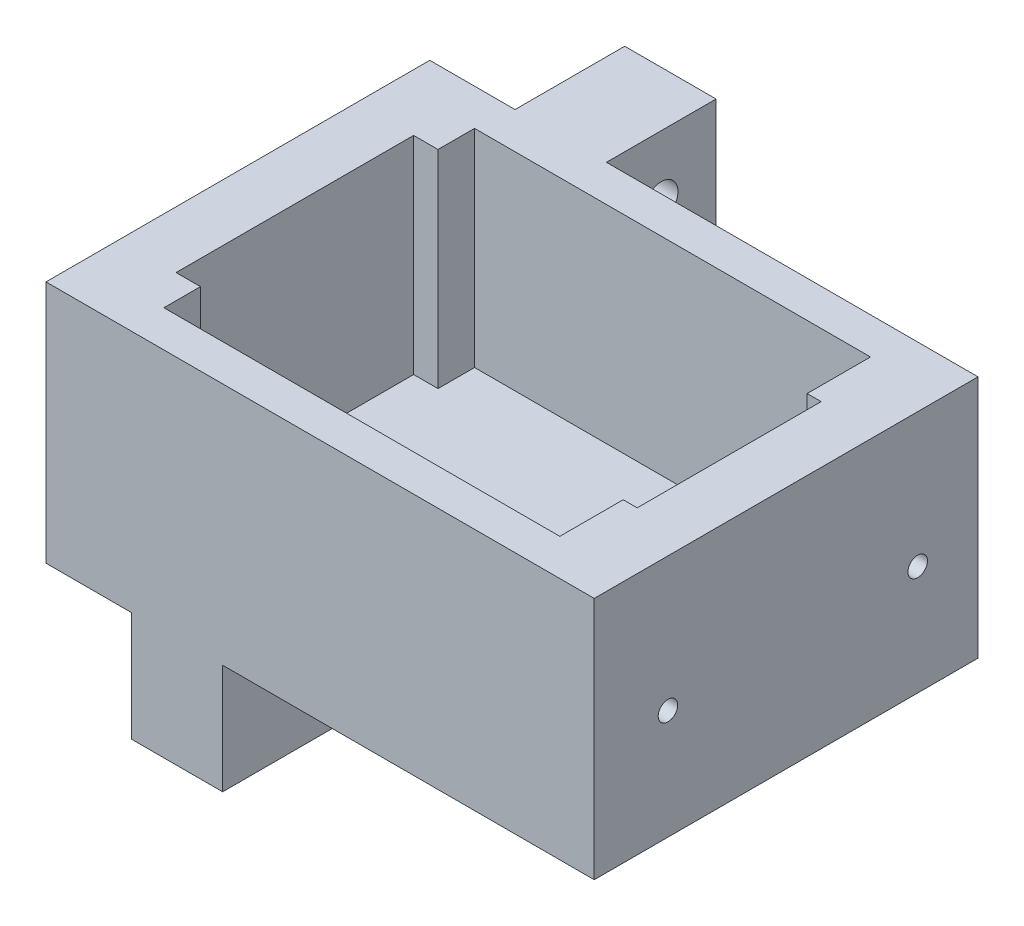
ISO-10303-21;
HEADER;
FILE_DESCRIPTION(('STEP AP214'),'2;1');
FILE_NAME('part.step','',(''),(''),'','','');
FILE_SCHEMA(('AUTOMOTIVE_DESIGN { 1 0 10303 214 1 1 1 1 }'));
ENDSEC;
DATA;
#1=APPLICATION_CONTEXT('core data for automotive mechanical design processes');
#2=APPLICATION_PROTOCOL_DEFINITION('international standard','automotive_design',2000,#1);
#3=PRODUCT_CONTEXT('',#1,'mechanical');
#4=PRODUCT('Part','Part','',(#3));
#5=PRODUCT_RELATED_PRODUCT_CATEGORY('part','',(#4));
#6=PRODUCT_DEFINITION_FORMATION('','',#4);
#7=PRODUCT_DEFINITION_CONTEXT('part definition',#1,'design');
#8=PRODUCT_DEFINITION('design','',#6,#7);
#9=PRODUCT_DEFINITION_SHAPE('','',#8);
#10=(LENGTH_UNIT() NAMED_UNIT(*) SI_UNIT(.MILLI.,.METRE.));
#11=(NAMED_UNIT(*) PLANE_ANGLE_UNIT() SI_UNIT($,.RADIAN.));
#12=(NAMED_UNIT(*) SI_UNIT($,.STERADIAN.) SOLID_ANGLE_UNIT());
#13=UNCERTAINTY_MEASURE_WITH_UNIT(LENGTH_MEASURE(1.E-05),#10,'distance_accuracy_value','');
#14=(GEOMETRIC_REPRESENTATION_CONTEXT(3) GLOBAL_UNCERTAINTY_ASSIGNED_CONTEXT((#13)) GLOBAL_UNIT_ASSIGNED_CONTEXT((#10,
#11,#12)) REPRESENTATION_CONTEXT('',''));
#15=CARTESIAN_POINT('',(0.,0.,0.));
#16=DIRECTION('',(0.,0.,1.));
#17=DIRECTION('',(1.,0.,0.));
#18=AXIS2_PLACEMENT_3D('',#15,#16,#17);
#19=CARTESIAN_POINT('',(0.,20.,-31.5));
#20=DIRECTION('',(0.,0.,1.));
#21=DIRECTION('',(1.,0.,0.));
#22=AXIS2_PLACEMENT_3D('',#19,#20,#21);
#23=PLANE('',#22);
#24=DIRECTION('',(0.,-1.,0.));
#25=VECTOR('',#24,1.);
#26=CARTESIAN_POINT('',(14.5,0.,-31.5));
#27=LINE('',#26,#25);
#28=CARTESIAN_POINT('',(14.5,20.,-31.5));
#29=VERTEX_POINT('',#28);
#30=CARTESIAN_POINT('',(14.5,0.,-31.5));
#31=VERTEX_POINT('',#30);
#32=EDGE_CURVE('E69',#29,#31,#27,.T.);
#33=ORIENTED_EDGE('',*,*,#32,.F.);
#34=DIRECTION('',(-1.,0.,0.));
#35=VECTOR('',#34,1.);
#36=CARTESIAN_POINT('',(0.,20.,-31.5));
#37=LINE('',#36,#35);
#38=CARTESIAN_POINT('',(45.,20.,-31.5));
#39=VERTEX_POINT('',#38);
#40=EDGE_CURVE('E485',#39,#29,#37,.T.);
#41=ORIENTED_EDGE('',*,*,#40,.F.);
#42=DIRECTION('',(0.,-1.,0.));
#43=VECTOR('',#42,1.);
#44=CARTESIAN_POINT('',(45.,20.,-31.5));
#45=LINE('',#44,#43);
#46=CARTESIAN_POINT('',(45.,0.,-31.5));
#47=VERTEX_POINT('',#46);
#48=EDGE_CURVE('E506',#39,#47,#45,.T.);
#49=ORIENTED_EDGE('',*,*,#48,.T.);
#50=DIRECTION('',(-1.,0.,0.));
#51=VECTOR('',#50,1.);
#52=CARTESIAN_POINT('',(0.,0.,-31.5));
#53=LINE('',#52,#51);
#54=EDGE_CURVE('E479',#47,#31,#53,.T.);
#55=ORIENTED_EDGE('',*,*,#54,.T.);
#56=EDGE_LOOP('',(#33,#41,#49,#55));
#57=FACE_BOUND('',#56,.T.);
#58=ADVANCED_FACE('F45',(#57),#23,.F.);
#59=CARTESIAN_POINT('',(0.,0.,0.));
#60=DIRECTION('',(0.,-1.,0.));
#61=DIRECTION('',(0.,0.,-1.));
#62=AXIS2_PLACEMENT_3D('',#59,#60,#61);
#63=PLANE('',#62);
#64=DIRECTION('',(-1.,0.,0.));
#65=VECTOR('',#64,1.);
#66=CARTESIAN_POINT('',(14.5,0.,-30.5));
#67=LINE('',#66,#65);
#68=CARTESIAN_POINT('',(14.5,0.,-30.5));
#69=VERTEX_POINT('',#68);
#70=CARTESIAN_POINT('',(7.,0.,-30.5));
#71=VERTEX_POINT('',#70);
#72=EDGE_CURVE('E294',#69,#71,#67,.T.);
#73=ORIENTED_EDGE('',*,*,#72,.T.);
#74=DIRECTION('',(0.,0.,1.));
#75=VECTOR('',#74,1.);
#76=CARTESIAN_POINT('',(7.,0.,0.));
#77=LINE('',#76,#75);
#78=CARTESIAN_POINT('',(7.,0.,0.));
#79=VERTEX_POINT('',#78);
#80=EDGE_CURVE('E302',#71,#79,#77,.T.);
#81=ORIENTED_EDGE('',*,*,#80,.T.);
#82=DIRECTION('',(1.,0.,0.));
#83=VECTOR('',#82,1.);
#84=CARTESIAN_POINT('',(0.,0.,0.));
#85=LINE('',#84,#83);
#86=CARTESIAN_POINT('',(0.,0.,0.));
#87=VERTEX_POINT('',#86);
#88=EDGE_CURVE('E493',#87,#79,#85,.T.);
#89=ORIENTED_EDGE('',*,*,#88,.F.);
#90=DIRECTION('',(0.,0.,1.));
#91=VECTOR('',#90,1.);
#92=CARTESIAN_POINT('',(0.,0.,0.));
#93=LINE('',#92,#91);
#94=CARTESIAN_POINT('',(0.,0.,-31.5));
#95=VERTEX_POINT('',#94);
#96=EDGE_CURVE('E440',#95,#87,#93,.T.);
#97=ORIENTED_EDGE('',*,*,#96,.F.);
#98=CARTESIAN_POINT('',(7.,0.,-31.5));
#99=VERTEX_POINT('',#98);
#100=EDGE_CURVE('E500',#99,#95,#53,.T.);
#101=ORIENTED_EDGE('',*,*,#100,.F.);
#102=DIRECTION('',(0.,0.,-1.));
#103=VECTOR('',#102,1.);
#104=CARTESIAN_POINT('',(7.,0.,0.));
#105=LINE('',#104,#103);
#106=CARTESIAN_POINT('',(7.,0.,-40.5));
#107=VERTEX_POINT('',#106);
#108=EDGE_CURVE('E224',#99,#107,#105,.T.);
#109=ORIENTED_EDGE('',*,*,#108,.T.);
#110=DIRECTION('',(-1.,0.,0.));
#111=VECTOR('',#110,1.);
#112=CARTESIAN_POINT('',(14.5,0.,-40.5));
#113=LINE('',#112,#111);
#114=CARTESIAN_POINT('',(14.5,0.,-40.5));
#115=VERTEX_POINT('',#114);
#116=EDGE_CURVE('E219',#115,#107,#113,.T.);
#117=ORIENTED_EDGE('',*,*,#116,.F.);
#118=DIRECTION('',(0.,0.,-1.));
#119=VECTOR('',#118,1.);
#120=CARTESIAN_POINT('',(14.5,0.,0.));
#121=LINE('',#120,#119);
#122=EDGE_CURVE('E207',#31,#115,#121,.T.);
#123=ORIENTED_EDGE('',*,*,#122,.F.);
#124=ORIENTED_EDGE('',*,*,#54,.F.);
#125=DIRECTION('',(0.,0.,-1.));
#126=VECTOR('',#125,1.);
#127=CARTESIAN_POINT('',(45.,0.,0.));
#128=LINE('',#127,#126);
#129=CARTESIAN_POINT('',(45.,0.,0.));
#130=VERTEX_POINT('',#129);
#131=EDGE_CURVE('E497',#130,#47,#128,.T.);
#132=ORIENTED_EDGE('',*,*,#131,.F.);
#133=CARTESIAN_POINT('',(14.5,0.,0.));
#134=VERTEX_POINT('',#133);
#135=EDGE_CURVE('E492',#134,#130,#85,.T.);
#136=ORIENTED_EDGE('',*,*,#135,.F.);
#137=DIRECTION('',(0.,0.,1.));
#138=VECTOR('',#137,1.);
#139=CARTESIAN_POINT('',(14.5,0.,0.));
#140=LINE('',#139,#138);
#141=EDGE_CURVE('E279',#69,#134,#140,.T.);
#142=ORIENTED_EDGE('',*,*,#141,.F.);
#143=EDGE_LOOP('',(#73,#81,#89,#97,#101,#109,#117,#123,#124,#132,#136,#142));
#144=FACE_BOUND('',#143,.T.);
#145=ADVANCED_FACE('F221',(#144),#63,.T.);
#146=CARTESIAN_POINT('',(0.,20.,0.));
#147=DIRECTION('',(1.,0.,0.));
#148=DIRECTION('',(0.,0.,-1.));
#149=AXIS2_PLACEMENT_3D('',#146,#147,#148);
#150=PLANE('',#149);
#151=ORIENTED_EDGE('',*,*,#96,.T.);
#152=DIRECTION('',(0.,-1.,0.));
#153=VECTOR('',#152,1.);
#154=CARTESIAN_POINT('',(0.,20.,0.));
#155=LINE('',#154,#153);
#156=CARTESIAN_POINT('',(0.,20.,0.));
#157=VERTEX_POINT('',#156);
#158=EDGE_CURVE('E11',#157,#87,#155,.T.);
#159=ORIENTED_EDGE('',*,*,#158,.F.);
#160=DIRECTION('',(0.,0.,1.));
#161=VECTOR('',#160,1.);
#162=CARTESIAN_POINT('',(0.,20.,0.));
#163=LINE('',#162,#161);
#164=CARTESIAN_POINT('',(0.,20.,-31.5));
#165=VERTEX_POINT('',#164);
#166=EDGE_CURVE('E474',#165,#157,#163,.T.);
#167=ORIENTED_EDGE('',*,*,#166,.F.);
#168=DIRECTION('',(0.,-1.,0.));
#169=VECTOR('',#168,1.);
#170=CARTESIAN_POINT('',(0.,20.,-31.5));
#171=LINE('',#170,#169);
#172=EDGE_CURVE('E488',#165,#95,#171,.T.);
#173=ORIENTED_EDGE('',*,*,#172,.T.);
#174=EDGE_LOOP('',(#151,#159,#167,#173));
#175=FACE_BOUND('',#174,.T.);
#176=ADVANCED_FACE('F47',(#175),#150,.F.);
#177=CARTESIAN_POINT('',(0.,20.,0.));
#178=DIRECTION('',(0.,0.,-1.));
#179=DIRECTION('',(-1.,0.,0.));
#180=AXIS2_PLACEMENT_3D('',#177,#178,#179);
#181=PLANE('',#180);
#182=ORIENTED_EDGE('',*,*,#88,.T.);
#183=DIRECTION('',(0.,-1.,0.));
#184=VECTOR('',#183,1.);
#185=CARTESIAN_POINT('',(7.,0.,0.));
#186=LINE('',#185,#184);
#187=CARTESIAN_POINT('',(7.,-9.,0.));
#188=VERTEX_POINT('',#187);
#189=EDGE_CURVE('E275',#79,#188,#186,.T.);
#190=ORIENTED_EDGE('',*,*,#189,.T.);
#191=DIRECTION('',(-1.,0.,0.));
#192=VECTOR('',#191,1.);
#193=CARTESIAN_POINT('',(14.5,-9.,0.));
#194=LINE('',#193,#192);
#195=CARTESIAN_POINT('',(14.5,-9.,0.));
#196=VERTEX_POINT('',#195);
#197=EDGE_CURVE('E317',#196,#188,#194,.T.);
#198=ORIENTED_EDGE('',*,*,#197,.F.);
#199=DIRECTION('',(0.,-1.,0.));
#200=VECTOR('',#199,1.);
#201=CARTESIAN_POINT('',(14.5,0.,0.));
#202=LINE('',#201,#200);
#203=EDGE_CURVE('E291',#134,#196,#202,.T.);
#204=ORIENTED_EDGE('',*,*,#203,.F.);
#205=ORIENTED_EDGE('',*,*,#135,.T.);
#206=DIRECTION('',(0.,-1.,0.));
#207=VECTOR('',#206,1.);
#208=CARTESIAN_POINT('',(45.,20.,0.));
#209=LINE('',#208,#207);
#210=CARTESIAN_POINT('',(45.,20.,0.));
#211=VERTEX_POINT('',#210);
#212=EDGE_CURVE('E54',#211,#130,#209,.T.);
#213=ORIENTED_EDGE('',*,*,#212,.F.);
#214=DIRECTION('',(1.,0.,0.));
#215=VECTOR('',#214,1.);
#216=CARTESIAN_POINT('',(0.,20.,0.));
#217=LINE('',#216,#215);
#218=EDGE_CURVE('E478',#157,#211,#217,.T.);
#219=ORIENTED_EDGE('',*,*,#218,.F.);
#220=ORIENTED_EDGE('',*,*,#158,.T.);
#221=EDGE_LOOP('',(#182,#190,#198,#204,#205,#213,#219,#220));
#222=FACE_BOUND('',#221,.T.);
#223=ADVANCED_FACE('F524',(#222),#181,.F.);
#224=CARTESIAN_POINT('',(45.,20.,0.));
#225=DIRECTION('',(-1.,0.,0.));
#226=DIRECTION('',(0.,0.,1.));
#227=AXIS2_PLACEMENT_3D('',#224,#225,#226);
#228=PLANE('',#227);
#229=CARTESIAN_POINT('',(45.,9.,-26.55));
#230=DIRECTION('',(-1.,0.,0.));
#231=DIRECTION('',(0.,0.,1.));
#232=AXIS2_PLACEMENT_3D('',#229,#230,#231);
#233=CIRCLE('',#232,0.799999999999999);
#234=CARTESIAN_POINT('',(45.,9.,-25.75));
#235=VERTEX_POINT('',#234);
#236=EDGE_CURVE('E330',#235,#235,#233,.F.);
#237=ORIENTED_EDGE('',*,*,#236,.F.);
#238=EDGE_LOOP('',(#237));
#239=FACE_BOUND('',#238,.T.);
#240=CARTESIAN_POINT('',(45.,9.,-6.05));
#241=DIRECTION('',(-1.,0.,0.));
#242=DIRECTION('',(0.,0.,1.));
#243=AXIS2_PLACEMENT_3D('',#240,#241,#242);
#244=CIRCLE('',#243,0.800000000000001);
#245=CARTESIAN_POINT('',(45.,9.,-5.25));
#246=VERTEX_POINT('',#245);
#247=EDGE_CURVE('E331',#246,#246,#244,.F.);
#248=ORIENTED_EDGE('',*,*,#247,.F.);
#249=EDGE_LOOP('',(#248));
#250=FACE_BOUND('',#249,.T.);
#251=ORIENTED_EDGE('',*,*,#131,.T.);
#252=ORIENTED_EDGE('',*,*,#48,.F.);
#253=DIRECTION('',(0.,0.,-1.));
#254=VECTOR('',#253,1.);
#255=CARTESIAN_POINT('',(45.,20.,0.));
#256=LINE('',#255,#254);
#257=EDGE_CURVE('E482',#211,#39,#256,.T.);
#258=ORIENTED_EDGE('',*,*,#257,.F.);
#259=ORIENTED_EDGE('',*,*,#212,.T.);
#260=EDGE_LOOP('',(#251,#252,#258,#259));
#261=FACE_BOUND('',#260,.T.);
#262=ADVANCED_FACE('F515',(#239,#250,#261),#228,.F.);
#263=CARTESIAN_POINT('',(7.,20.,-31.5));
#264=VERTEX_POINT('',#263);
#265=EDGE_CURVE('E61',#264,#165,#37,.T.);
#266=ORIENTED_EDGE('',*,*,#265,.F.);
#267=DIRECTION('',(0.,-1.,0.));
#268=VECTOR('',#267,1.);
#269=CARTESIAN_POINT('',(7.,0.,-31.5));
#270=LINE('',#269,#268);
#271=EDGE_CURVE('E260',#264,#99,#270,.T.);
#272=ORIENTED_EDGE('',*,*,#271,.T.);
#273=ORIENTED_EDGE('',*,*,#100,.T.);
#274=ORIENTED_EDGE('',*,*,#172,.F.);
#275=EDGE_LOOP('',(#266,#272,#273,#274));
#276=FACE_BOUND('',#275,.T.);
#277=ADVANCED_FACE('F556',(#276),#23,.F.);
#278=CARTESIAN_POINT('',(0.,20.,0.));
#279=DIRECTION('',(0.,-1.,0.));
#280=DIRECTION('',(0.,0.,-1.));
#281=AXIS2_PLACEMENT_3D('',#278,#279,#280);
#282=PLANE('',#281);
#283=DIRECTION('',(-1.,0.,0.));
#284=VECTOR('',#283,1.);
#285=CARTESIAN_POINT('',(6.675,20.,-25.5));
#286=LINE('',#285,#284);
#287=CARTESIAN_POINT('',(6.675,20.,-25.5));
#288=VERTEX_POINT('',#287);
#289=CARTESIAN_POINT('',(4.67500000000001,20.,-25.5));
#290=VERTEX_POINT('',#289);
#291=EDGE_CURVE('E394',#288,#290,#286,.T.);
#292=ORIENTED_EDGE('',*,*,#291,.F.);
#293=DIRECTION('',(0.,0.,1.));
#294=VECTOR('',#293,1.);
#295=CARTESIAN_POINT('',(6.675,20.,-28.5));
#296=LINE('',#295,#294);
#297=CARTESIAN_POINT('',(6.675,20.,-28.5));
#298=VERTEX_POINT('',#297);
#299=EDGE_CURVE('E335',#298,#288,#296,.T.);
#300=ORIENTED_EDGE('',*,*,#299,.F.);
#301=DIRECTION('',(-1.,0.,0.));
#302=VECTOR('',#301,1.);
#303=CARTESIAN_POINT('',(39.175,20.,-28.5));
#304=LINE('',#303,#302);
#305=CARTESIAN_POINT('',(39.175,20.,-28.5));
#306=VERTEX_POINT('',#305);
#307=EDGE_CURVE('E347',#306,#298,#304,.T.);
#308=ORIENTED_EDGE('',*,*,#307,.F.);
#309=DIRECTION('',(0.,0.,-1.));
#310=VECTOR('',#309,1.);
#311=CARTESIAN_POINT('',(39.175,20.,-23.3));
#312=LINE('',#311,#310);
#313=CARTESIAN_POINT('',(39.175,20.,-23.3));
#314=VERTEX_POINT('',#313);
#315=EDGE_CURVE('E430',#314,#306,#312,.T.);
#316=ORIENTED_EDGE('',*,*,#315,.F.);
#317=DIRECTION('',(-1.,0.,0.));
#318=VECTOR('',#317,1.);
#319=CARTESIAN_POINT('',(40.325,20.,-23.3));
#320=LINE('',#319,#318);
#321=CARTESIAN_POINT('',(40.325,20.,-23.3));
#322=VERTEX_POINT('',#321);
#323=EDGE_CURVE('E426',#322,#314,#320,.T.);
#324=ORIENTED_EDGE('',*,*,#323,.F.);
#325=DIRECTION('',(0.,0.,-1.));
#326=VECTOR('',#325,1.);
#327=CARTESIAN_POINT('',(40.325,20.,-8.2));
#328=LINE('',#327,#326);
#329=CARTESIAN_POINT('',(40.325,20.,-8.2));
#330=VERTEX_POINT('',#329);
#331=EDGE_CURVE('E422',#330,#322,#328,.T.);
#332=ORIENTED_EDGE('',*,*,#331,.F.);
#333=DIRECTION('',(1.,0.,0.));
#334=VECTOR('',#333,1.);
#335=CARTESIAN_POINT('',(39.175,20.,-8.2));
#336=LINE('',#335,#334);
#337=CARTESIAN_POINT('',(39.175,20.,-8.2));
#338=VERTEX_POINT('',#337);
#339=EDGE_CURVE('E418',#338,#330,#336,.T.);
#340=ORIENTED_EDGE('',*,*,#339,.F.);
#341=DIRECTION('',(0.,0.,-1.));
#342=VECTOR('',#341,1.);
#343=CARTESIAN_POINT('',(39.175,20.,-3.));
#344=LINE('',#343,#342);
#345=CARTESIAN_POINT('',(39.175,20.,-3.));
#346=VERTEX_POINT('',#345);
#347=EDGE_CURVE('E414',#346,#338,#344,.T.);
#348=ORIENTED_EDGE('',*,*,#347,.F.);
#349=DIRECTION('',(1.,0.,0.));
#350=VECTOR('',#349,1.);
#351=CARTESIAN_POINT('',(6.675,20.,-3.));
#352=LINE('',#351,#350);
#353=CARTESIAN_POINT('',(6.675,20.,-3.));
#354=VERTEX_POINT('',#353);
#355=EDGE_CURVE('E410',#354,#346,#352,.T.);
#356=ORIENTED_EDGE('',*,*,#355,.F.);
#357=DIRECTION('',(0.,0.,1.));
#358=VECTOR('',#357,1.);
#359=CARTESIAN_POINT('',(6.675,20.,-6.));
#360=LINE('',#359,#358);
#361=CARTESIAN_POINT('',(6.675,20.,-6.));
#362=VERTEX_POINT('',#361);
#363=EDGE_CURVE('E406',#362,#354,#360,.T.);
#364=ORIENTED_EDGE('',*,*,#363,.F.);
#365=DIRECTION('',(1.,0.,0.));
#366=VECTOR('',#365,1.);
#367=CARTESIAN_POINT('',(4.67500000000001,20.,-6.));
#368=LINE('',#367,#366);
#369=CARTESIAN_POINT('',(4.67500000000001,20.,-6.));
#370=VERTEX_POINT('',#369);
#371=EDGE_CURVE('E402',#370,#362,#368,.T.);
#372=ORIENTED_EDGE('',*,*,#371,.F.);
#373=DIRECTION('',(0.,0.,1.));
#374=VECTOR('',#373,1.);
#375=CARTESIAN_POINT('',(4.67500000000001,20.,-25.5));
#376=LINE('',#375,#374);
#377=EDGE_CURVE('E398',#290,#370,#376,.T.);
#378=ORIENTED_EDGE('',*,*,#377,.F.);
#379=EDGE_LOOP('',(#292,#300,#308,#316,#324,#332,#340,#348,#356,#364,#372,#378));
#380=FACE_BOUND('',#379,.T.);
#381=ORIENTED_EDGE('',*,*,#166,.T.);
#382=ORIENTED_EDGE('',*,*,#218,.T.);
#383=ORIENTED_EDGE('',*,*,#257,.T.);
#384=ORIENTED_EDGE('',*,*,#40,.T.);
#385=DIRECTION('',(0.,0.,-1.));
#386=VECTOR('',#385,1.);
#387=CARTESIAN_POINT('',(14.5,20.,0.));
#388=LINE('',#387,#386);
#389=CARTESIAN_POINT('',(14.5,20.,-40.5));
#390=VERTEX_POINT('',#389);
#391=EDGE_CURVE('E230',#29,#390,#388,.T.);
#392=ORIENTED_EDGE('',*,*,#391,.T.);
#393=DIRECTION('',(-1.,0.,0.));
#394=VECTOR('',#393,1.);
#395=CARTESIAN_POINT('',(14.5,20.,-40.5));
#396=LINE('',#395,#394);
#397=CARTESIAN_POINT('',(7.,20.,-40.5));
#398=VERTEX_POINT('',#397);
#399=EDGE_CURVE('E229',#390,#398,#396,.T.);
#400=ORIENTED_EDGE('',*,*,#399,.T.);
#401=DIRECTION('',(0.,0.,-1.));
#402=VECTOR('',#401,1.);
#403=CARTESIAN_POINT('',(7.,20.,0.));
#404=LINE('',#403,#402);
#405=EDGE_CURVE('E263',#264,#398,#404,.T.);
#406=ORIENTED_EDGE('',*,*,#405,.F.);
#407=ORIENTED_EDGE('',*,*,#265,.T.);
#408=EDGE_LOOP('',(#381,#382,#383,#384,#392,#400,#406,#407));
#409=FACE_BOUND('',#408,.T.);
#410=ADVANCED_FACE('F521',(#380,#409),#282,.F.);
#411=CARTESIAN_POINT('',(6.675,3.,-28.5));
#412=DIRECTION('',(-1.,0.,0.));
#413=DIRECTION('',(0.,0.,1.));
#414=AXIS2_PLACEMENT_3D('',#411,#412,#413);
#415=PLANE('',#414);
#416=ORIENTED_EDGE('',*,*,#299,.T.);
#417=DIRECTION('',(0.,1.,0.));
#418=VECTOR('',#417,1.);
#419=CARTESIAN_POINT('',(6.675,3.,-25.5));
#420=LINE('',#419,#418);
#421=CARTESIAN_POINT('',(6.675,3.,-25.5));
#422=VERTEX_POINT('',#421);
#423=EDGE_CURVE('E391',#422,#288,#420,.T.);
#424=ORIENTED_EDGE('',*,*,#423,.F.);
#425=DIRECTION('',(0.,0.,1.));
#426=VECTOR('',#425,1.);
#427=CARTESIAN_POINT('',(6.675,3.,-28.5));
#428=LINE('',#427,#426);
#429=CARTESIAN_POINT('',(6.675,3.,-28.5));
#430=VERTEX_POINT('',#429);
#431=EDGE_CURVE('E342',#430,#422,#428,.T.);
#432=ORIENTED_EDGE('',*,*,#431,.F.);
#433=DIRECTION('',(0.,1.,0.));
#434=VECTOR('',#433,1.);
#435=CARTESIAN_POINT('',(6.675,3.,-28.5));
#436=LINE('',#435,#434);
#437=EDGE_CURVE('E437',#430,#298,#436,.T.);
#438=ORIENTED_EDGE('',*,*,#437,.T.);
#439=EDGE_LOOP('',(#416,#424,#432,#438));
#440=FACE_BOUND('',#439,.T.);
#441=ADVANCED_FACE('F567',(#440),#415,.F.);
#442=CARTESIAN_POINT('',(39.175,3.,-28.5));
#443=DIRECTION('',(0.,0.,-1.));
#444=DIRECTION('',(-1.,0.,0.));
#445=AXIS2_PLACEMENT_3D('',#442,#443,#444);
#446=PLANE('',#445);
#447=ORIENTED_EDGE('',*,*,#307,.T.);
#448=ORIENTED_EDGE('',*,*,#437,.F.);
#449=DIRECTION('',(-1.,0.,0.));
#450=VECTOR('',#449,1.);
#451=CARTESIAN_POINT('',(39.175,3.,-28.5));
#452=LINE('',#451,#450);
#453=CARTESIAN_POINT('',(39.175,3.,-28.5));
#454=VERTEX_POINT('',#453);
#455=EDGE_CURVE('E387',#454,#430,#452,.T.);
#456=ORIENTED_EDGE('',*,*,#455,.F.);
#457=DIRECTION('',(0.,1.,0.));
#458=VECTOR('',#457,1.);
#459=CARTESIAN_POINT('',(39.175,3.,-28.5));
#460=LINE('',#459,#458);
#461=EDGE_CURVE('E441',#454,#306,#460,.T.);
#462=ORIENTED_EDGE('',*,*,#461,.T.);
#463=EDGE_LOOP('',(#447,#448,#456,#462));
#464=FACE_BOUND('',#463,.T.);
#465=ADVANCED_FACE('F626',(#464),#446,.F.);
#466=CARTESIAN_POINT('',(39.175,3.,-23.3));
#467=DIRECTION('',(1.,0.,0.));
#468=DIRECTION('',(0.,0.,-1.));
#469=AXIS2_PLACEMENT_3D('',#466,#467,#468);
#470=PLANE('',#469);
#471=CARTESIAN_POINT('',(39.175,9.,-26.55));
#472=DIRECTION('',(-1.,0.,0.));
#473=DIRECTION('',(0.,0.,1.));
#474=AXIS2_PLACEMENT_3D('',#471,#472,#473);
#475=CIRCLE('',#474,0.799999999999999);
#476=CARTESIAN_POINT('',(39.175,9.,-25.75));
#477=VERTEX_POINT('',#476);
#478=EDGE_CURVE('E326',#477,#477,#475,.T.);
#479=ORIENTED_EDGE('',*,*,#478,.F.);
#480=EDGE_LOOP('',(#479));
#481=FACE_BOUND('',#480,.T.);
#482=ORIENTED_EDGE('',*,*,#315,.T.);
#483=ORIENTED_EDGE('',*,*,#461,.F.);
#484=DIRECTION('',(0.,0.,-1.));
#485=VECTOR('',#484,1.);
#486=CARTESIAN_POINT('',(39.175,3.,-23.3));
#487=LINE('',#486,#485);
#488=CARTESIAN_POINT('',(39.175,3.,-23.3));
#489=VERTEX_POINT('',#488);
#490=EDGE_CURVE('E383',#489,#454,#487,.T.);
#491=ORIENTED_EDGE('',*,*,#490,.F.);
#492=DIRECTION('',(0.,1.,0.));
#493=VECTOR('',#492,1.);
#494=CARTESIAN_POINT('',(39.175,3.,-23.3));
#495=LINE('',#494,#493);
#496=EDGE_CURVE('E444',#489,#314,#495,.T.);
#497=ORIENTED_EDGE('',*,*,#496,.T.);
#498=EDGE_LOOP('',(#482,#483,#491,#497));
#499=FACE_BOUND('',#498,.T.);
#500=ADVANCED_FACE('F629',(#481,#499),#470,.F.);
#501=CARTESIAN_POINT('',(40.325,3.,-23.3));
#502=DIRECTION('',(0.,0.,-1.));
#503=DIRECTION('',(-1.,0.,0.));
#504=AXIS2_PLACEMENT_3D('',#501,#502,#503);
#505=PLANE('',#504);
#506=ORIENTED_EDGE('',*,*,#323,.T.);
#507=ORIENTED_EDGE('',*,*,#496,.F.);
#508=DIRECTION('',(-1.,0.,0.));
#509=VECTOR('',#508,1.);
#510=CARTESIAN_POINT('',(40.325,3.,-23.3));
#511=LINE('',#510,#509);
#512=CARTESIAN_POINT('',(40.325,3.,-23.3));
#513=VERTEX_POINT('',#512);
#514=EDGE_CURVE('E379',#513,#489,#511,.T.);
#515=ORIENTED_EDGE('',*,*,#514,.F.);
#516=DIRECTION('',(0.,1.,0.));
#517=VECTOR('',#516,1.);
#518=CARTESIAN_POINT('',(40.325,3.,-23.3));
#519=LINE('',#518,#517);
#520=EDGE_CURVE('E447',#513,#322,#519,.T.);
#521=ORIENTED_EDGE('',*,*,#520,.T.);
#522=EDGE_LOOP('',(#506,#507,#515,#521));
#523=FACE_BOUND('',#522,.T.);
#524=ADVANCED_FACE('F633',(#523),#505,.F.);
#525=CARTESIAN_POINT('',(40.325,3.,-8.2));
#526=DIRECTION('',(1.,0.,0.));
#527=DIRECTION('',(0.,0.,-1.));
#528=AXIS2_PLACEMENT_3D('',#525,#526,#527);
#529=PLANE('',#528);
#530=ORIENTED_EDGE('',*,*,#331,.T.);
#531=ORIENTED_EDGE('',*,*,#520,.F.);
#532=DIRECTION('',(0.,0.,-1.));
#533=VECTOR('',#532,1.);
#534=CARTESIAN_POINT('',(40.325,3.,-8.2));
#535=LINE('',#534,#533);
#536=CARTESIAN_POINT('',(40.325,3.,-8.2));
#537=VERTEX_POINT('',#536);
#538=EDGE_CURVE('E375',#537,#513,#535,.T.);
#539=ORIENTED_EDGE('',*,*,#538,.F.);
#540=DIRECTION('',(0.,1.,0.));
#541=VECTOR('',#540,1.);
#542=CARTESIAN_POINT('',(40.325,3.,-8.2));
#543=LINE('',#542,#541);
#544=EDGE_CURVE('E450',#537,#330,#543,.T.);
#545=ORIENTED_EDGE('',*,*,#544,.T.);
#546=EDGE_LOOP('',(#530,#531,#539,#545));
#547=FACE_BOUND('',#546,.T.);
#548=ADVANCED_FACE('F635',(#547),#529,.F.);
#549=CARTESIAN_POINT('',(39.175,3.,-8.2));
#550=DIRECTION('',(0.,0.,1.));
#551=DIRECTION('',(1.,0.,0.));
#552=AXIS2_PLACEMENT_3D('',#549,#550,#551);
#553=PLANE('',#552);
#554=ORIENTED_EDGE('',*,*,#339,.T.);
#555=ORIENTED_EDGE('',*,*,#544,.F.);
#556=DIRECTION('',(1.,0.,0.));
#557=VECTOR('',#556,1.);
#558=CARTESIAN_POINT('',(39.175,3.,-8.2));
#559=LINE('',#558,#557);
#560=CARTESIAN_POINT('',(39.175,3.,-8.2));
#561=VERTEX_POINT('',#560);
#562=EDGE_CURVE('E371',#561,#537,#559,.T.);
#563=ORIENTED_EDGE('',*,*,#562,.F.);
#564=DIRECTION('',(0.,1.,0.));
#565=VECTOR('',#564,1.);
#566=CARTESIAN_POINT('',(39.175,3.,-8.2));
#567=LINE('',#566,#565);
#568=EDGE_CURVE('E453',#561,#338,#567,.T.);
#569=ORIENTED_EDGE('',*,*,#568,.T.);
#570=EDGE_LOOP('',(#554,#555,#563,#569));
#571=FACE_BOUND('',#570,.T.);
#572=ADVANCED_FACE('F590',(#571),#553,.F.);
#573=CARTESIAN_POINT('',(39.175,3.,-3.));
#574=DIRECTION('',(1.,0.,0.));
#575=DIRECTION('',(0.,0.,-1.));
#576=AXIS2_PLACEMENT_3D('',#573,#574,#575);
#577=PLANE('',#576);
#578=CARTESIAN_POINT('',(39.175,9.,-6.05));
#579=DIRECTION('',(-1.,0.,0.));
#580=DIRECTION('',(0.,0.,1.));
#581=AXIS2_PLACEMENT_3D('',#578,#579,#580);
#582=CIRCLE('',#581,0.800000000000001);
#583=CARTESIAN_POINT('',(39.175,9.,-5.25));
#584=VERTEX_POINT('',#583);
#585=EDGE_CURVE('E320',#584,#584,#582,.T.);
#586=ORIENTED_EDGE('',*,*,#585,.F.);
#587=EDGE_LOOP('',(#586));
#588=FACE_BOUND('',#587,.T.);
#589=ORIENTED_EDGE('',*,*,#347,.T.);
#590=ORIENTED_EDGE('',*,*,#568,.F.);
#591=DIRECTION('',(0.,0.,-1.));
#592=VECTOR('',#591,1.);
#593=CARTESIAN_POINT('',(39.175,3.,-3.));
#594=LINE('',#593,#592);
#595=CARTESIAN_POINT('',(39.175,3.,-3.));
#596=VERTEX_POINT('',#595);
#597=EDGE_CURVE('E367',#596,#561,#594,.T.);
#598=ORIENTED_EDGE('',*,*,#597,.F.);
#599=DIRECTION('',(0.,1.,0.));
#600=VECTOR('',#599,1.);
#601=CARTESIAN_POINT('',(39.175,3.,-3.));
#602=LINE('',#601,#600);
#603=EDGE_CURVE('E456',#596,#346,#602,.T.);
#604=ORIENTED_EDGE('',*,*,#603,.T.);
#605=EDGE_LOOP('',(#589,#590,#598,#604));
#606=FACE_BOUND('',#605,.T.);
#607=ADVANCED_FACE('F586',(#588,#606),#577,.F.);
#608=CARTESIAN_POINT('',(6.675,3.,-3.));
#609=DIRECTION('',(0.,0.,1.));
#610=DIRECTION('',(1.,0.,0.));
#611=AXIS2_PLACEMENT_3D('',#608,#609,#610);
#612=PLANE('',#611);
#613=ORIENTED_EDGE('',*,*,#355,.T.);
#614=ORIENTED_EDGE('',*,*,#603,.F.);
#615=DIRECTION('',(1.,0.,0.));
#616=VECTOR('',#615,1.);
#617=CARTESIAN_POINT('',(6.675,3.,-3.));
#618=LINE('',#617,#616);
#619=CARTESIAN_POINT('',(6.675,3.,-3.));
#620=VERTEX_POINT('',#619);
#621=EDGE_CURVE('E363',#620,#596,#618,.T.);
#622=ORIENTED_EDGE('',*,*,#621,.F.);
#623=DIRECTION('',(0.,1.,0.));
#624=VECTOR('',#623,1.);
#625=CARTESIAN_POINT('',(6.675,3.,-3.));
#626=LINE('',#625,#624);
#627=EDGE_CURVE('E459',#620,#354,#626,.T.);
#628=ORIENTED_EDGE('',*,*,#627,.T.);
#629=EDGE_LOOP('',(#613,#614,#622,#628));
#630=FACE_BOUND('',#629,.T.);
#631=ADVANCED_FACE('F589',(#630),#612,.F.);
#632=CARTESIAN_POINT('',(6.675,3.,-6.));
#633=DIRECTION('',(-1.,0.,0.));
#634=DIRECTION('',(0.,0.,1.));
#635=AXIS2_PLACEMENT_3D('',#632,#633,#634);
#636=PLANE('',#635);
#637=ORIENTED_EDGE('',*,*,#363,.T.);
#638=ORIENTED_EDGE('',*,*,#627,.F.);
#639=DIRECTION('',(0.,0.,1.));
#640=VECTOR('',#639,1.);
#641=CARTESIAN_POINT('',(6.675,3.,-6.));
#642=LINE('',#641,#640);
#643=CARTESIAN_POINT('',(6.675,3.,-6.));
#644=VERTEX_POINT('',#643);
#645=EDGE_CURVE('E359',#644,#620,#642,.T.);
#646=ORIENTED_EDGE('',*,*,#645,.F.);
#647=DIRECTION('',(0.,1.,0.));
#648=VECTOR('',#647,1.);
#649=CARTESIAN_POINT('',(6.675,3.,-6.));
#650=LINE('',#649,#648);
#651=EDGE_CURVE('E462',#644,#362,#650,.T.);
#652=ORIENTED_EDGE('',*,*,#651,.T.);
#653=EDGE_LOOP('',(#637,#638,#646,#652));
#654=FACE_BOUND('',#653,.T.);
#655=ADVANCED_FACE('F610',(#654),#636,.F.);
#656=CARTESIAN_POINT('',(4.67500000000001,3.,-6.));
#657=DIRECTION('',(0.,0.,1.));
#658=DIRECTION('',(1.,0.,0.));
#659=AXIS2_PLACEMENT_3D('',#656,#657,#658);
#660=PLANE('',#659);
#661=ORIENTED_EDGE('',*,*,#371,.T.);
#662=ORIENTED_EDGE('',*,*,#651,.F.);
#663=DIRECTION('',(1.,0.,0.));
#664=VECTOR('',#663,1.);
#665=CARTESIAN_POINT('',(4.67500000000001,3.,-6.));
#666=LINE('',#665,#664);
#667=CARTESIAN_POINT('',(4.67500000000001,3.,-6.));
#668=VERTEX_POINT('',#667);
#669=EDGE_CURVE('E355',#668,#644,#666,.T.);
#670=ORIENTED_EDGE('',*,*,#669,.F.);
#671=DIRECTION('',(0.,1.,0.));
#672=VECTOR('',#671,1.);
#673=CARTESIAN_POINT('',(4.67500000000001,3.,-6.));
#674=LINE('',#673,#672);
#675=EDGE_CURVE('E465',#668,#370,#674,.T.);
#676=ORIENTED_EDGE('',*,*,#675,.T.);
#677=EDGE_LOOP('',(#661,#662,#670,#676));
#678=FACE_BOUND('',#677,.T.);
#679=ADVANCED_FACE('F613',(#678),#660,.F.);
#680=CARTESIAN_POINT('',(4.67500000000001,3.,-25.5));
#681=DIRECTION('',(-1.,0.,0.));
#682=DIRECTION('',(0.,0.,1.));
#683=AXIS2_PLACEMENT_3D('',#680,#681,#682);
#684=PLANE('',#683);
#685=ORIENTED_EDGE('',*,*,#377,.T.);
#686=ORIENTED_EDGE('',*,*,#675,.F.);
#687=DIRECTION('',(0.,0.,1.));
#688=VECTOR('',#687,1.);
#689=CARTESIAN_POINT('',(4.67500000000001,3.,-25.5));
#690=LINE('',#689,#688);
#691=CARTESIAN_POINT('',(4.67500000000001,3.,-25.5));
#692=VERTEX_POINT('',#691);
#693=EDGE_CURVE('E351',#692,#668,#690,.T.);
#694=ORIENTED_EDGE('',*,*,#693,.F.);
#695=DIRECTION('',(0.,1.,0.));
#696=VECTOR('',#695,1.);
#697=CARTESIAN_POINT('',(4.67500000000001,3.,-25.5));
#698=LINE('',#697,#696);
#699=EDGE_CURVE('E468',#692,#290,#698,.T.);
#700=ORIENTED_EDGE('',*,*,#699,.T.);
#701=EDGE_LOOP('',(#685,#686,#694,#700));
#702=FACE_BOUND('',#701,.T.);
#703=ADVANCED_FACE('F616',(#702),#684,.F.);
#704=CARTESIAN_POINT('',(6.675,3.,-25.5));
#705=DIRECTION('',(0.,0.,-1.));
#706=DIRECTION('',(-1.,0.,0.));
#707=AXIS2_PLACEMENT_3D('',#704,#705,#706);
#708=PLANE('',#707);
#709=ORIENTED_EDGE('',*,*,#291,.T.);
#710=ORIENTED_EDGE('',*,*,#699,.F.);
#711=DIRECTION('',(-1.,0.,0.));
#712=VECTOR('',#711,1.);
#713=CARTESIAN_POINT('',(6.675,3.,-25.5));
#714=LINE('',#713,#712);
#715=EDGE_CURVE('E346',#422,#692,#714,.T.);
#716=ORIENTED_EDGE('',*,*,#715,.F.);
#717=ORIENTED_EDGE('',*,*,#423,.T.);
#718=EDGE_LOOP('',(#709,#710,#716,#717));
#719=FACE_BOUND('',#718,.T.);
#720=ADVANCED_FACE('F620',(#719),#708,.F.);
#721=CARTESIAN_POINT('',(0.,3.,0.));
#722=DIRECTION('',(0.,-1.,0.));
#723=DIRECTION('',(0.,0.,-1.));
#724=AXIS2_PLACEMENT_3D('',#721,#722,#723);
#725=PLANE('',#724);
#726=ORIENTED_EDGE('',*,*,#431,.T.);
#727=ORIENTED_EDGE('',*,*,#715,.T.);
#728=ORIENTED_EDGE('',*,*,#693,.T.);
#729=ORIENTED_EDGE('',*,*,#669,.T.);
#730=ORIENTED_EDGE('',*,*,#645,.T.);
#731=ORIENTED_EDGE('',*,*,#621,.T.);
#732=ORIENTED_EDGE('',*,*,#597,.T.);
#733=ORIENTED_EDGE('',*,*,#562,.T.);
#734=ORIENTED_EDGE('',*,*,#538,.T.);
#735=ORIENTED_EDGE('',*,*,#514,.T.);
#736=ORIENTED_EDGE('',*,*,#490,.T.);
#737=ORIENTED_EDGE('',*,*,#455,.T.);
#738=EDGE_LOOP('',(#726,#727,#728,#729,#730,#731,#732,#733,#734,#735,#736,#737));
#739=FACE_BOUND('',#738,.T.);
#740=ADVANCED_FACE('F582',(#739),#725,.F.);
#741=CARTESIAN_POINT('',(47.262741699797,9.,-6.05));
#742=DIRECTION('',(-1.,0.,0.));
#743=DIRECTION('',(0.,0.,1.));
#744=AXIS2_PLACEMENT_3D('',#741,#742,#743);
#745=CYLINDRICAL_SURFACE('',#744,0.800000000000001);
#746=ORIENTED_EDGE('',*,*,#247,.T.);
#747=EDGE_LOOP('',(#746));
#748=FACE_BOUND('',#747,.T.);
#749=ORIENTED_EDGE('',*,*,#585,.T.);
#750=EDGE_LOOP('',(#749));
#751=FACE_BOUND('',#750,.T.);
#752=ADVANCED_FACE('F578',(#748,#751),#745,.F.);
#753=CARTESIAN_POINT('',(47.262741699797,9.,-26.55));
#754=DIRECTION('',(-1.,0.,0.));
#755=DIRECTION('',(0.,0.,1.));
#756=AXIS2_PLACEMENT_3D('',#753,#754,#755);
#757=CYLINDRICAL_SURFACE('',#756,0.799999999999999);
#758=ORIENTED_EDGE('',*,*,#236,.T.);
#759=EDGE_LOOP('',(#758));
#760=FACE_BOUND('',#759,.T.);
#761=ORIENTED_EDGE('',*,*,#478,.T.);
#762=EDGE_LOOP('',(#761));
#763=FACE_BOUND('',#762,.T.);
#764=ADVANCED_FACE('F581',(#760,#763),#757,.F.);
#765=CARTESIAN_POINT('',(14.5,-9.,0.));
#766=DIRECTION('',(0.,-1.,0.));
#767=DIRECTION('',(0.,0.,-1.));
#768=AXIS2_PLACEMENT_3D('',#765,#766,#767);
#769=PLANE('',#768);
#770=DIRECTION('',(0.,0.,1.));
#771=VECTOR('',#770,1.);
#772=CARTESIAN_POINT('',(7.,-9.,0.));
#773=LINE('',#772,#771);
#774=CARTESIAN_POINT('',(7.,-9.,-30.5));
#775=VERTEX_POINT('',#774);
#776=EDGE_CURVE('E310',#775,#188,#773,.T.);
#777=ORIENTED_EDGE('',*,*,#776,.F.);
#778=DIRECTION('',(-1.,0.,0.));
#779=VECTOR('',#778,1.);
#780=CARTESIAN_POINT('',(14.5,-9.,-30.5));
#781=LINE('',#780,#779);
#782=CARTESIAN_POINT('',(14.5,-9.,-30.5));
#783=VERTEX_POINT('',#782);
#784=EDGE_CURVE('E321',#783,#775,#781,.T.);
#785=ORIENTED_EDGE('',*,*,#784,.F.);
#786=DIRECTION('',(0.,0.,1.));
#787=VECTOR('',#786,1.);
#788=CARTESIAN_POINT('',(14.5,-9.,0.));
#789=LINE('',#788,#787);
#790=EDGE_CURVE('E287',#783,#196,#789,.T.);
#791=ORIENTED_EDGE('',*,*,#790,.T.);
#792=ORIENTED_EDGE('',*,*,#197,.T.);
#793=EDGE_LOOP('',(#777,#785,#791,#792));
#794=FACE_BOUND('',#793,.T.);
#795=ADVANCED_FACE('F534',(#794),#769,.T.);
#796=CARTESIAN_POINT('',(14.5,-4.5,-24.));
#797=DIRECTION('',(-1.,0.,0.));
#798=DIRECTION('',(0.,0.,1.));
#799=AXIS2_PLACEMENT_3D('',#796,#797,#798);
#800=CYLINDRICAL_SURFACE('',#799,1.375);
#801=CARTESIAN_POINT('',(14.5,-4.5,-24.));
#802=DIRECTION('',(-1.,0.,0.));
#803=DIRECTION('',(0.,0.,1.));
#804=AXIS2_PLACEMENT_3D('',#801,#802,#803);
#805=CIRCLE('',#804,1.375);
#806=CARTESIAN_POINT('',(14.5,-4.5,-22.625));
#807=VERTEX_POINT('',#806);
#808=EDGE_CURVE('E274',#807,#807,#805,.T.);
#809=ORIENTED_EDGE('',*,*,#808,.F.);
#810=EDGE_LOOP('',(#809));
#811=FACE_BOUND('',#810,.T.);
#812=CARTESIAN_POINT('',(7.,-4.5,-24.));
#813=DIRECTION('',(-1.,0.,0.));
#814=DIRECTION('',(0.,0.,1.));
#815=AXIS2_PLACEMENT_3D('',#812,#813,#814);
#816=CIRCLE('',#815,1.375);
#817=CARTESIAN_POINT('',(7.,-4.5,-22.625));
#818=VERTEX_POINT('',#817);
#819=EDGE_CURVE('E298',#818,#818,#816,.T.);
#820=ORIENTED_EDGE('',*,*,#819,.T.);
#821=EDGE_LOOP('',(#820));
#822=FACE_BOUND('',#821,.T.);
#823=ADVANCED_FACE('F549',(#811,#822),#800,.F.);
#824=CARTESIAN_POINT('',(14.5,-4.5,-7.5));
#825=DIRECTION('',(-1.,0.,0.));
#826=DIRECTION('',(0.,0.,1.));
#827=AXIS2_PLACEMENT_3D('',#824,#825,#826);
#828=CYLINDRICAL_SURFACE('',#827,1.375);
#829=CARTESIAN_POINT('',(14.5,-4.5,-7.5));
#830=DIRECTION('',(-1.,0.,0.));
#831=DIRECTION('',(0.,0.,1.));
#832=AXIS2_PLACEMENT_3D('',#829,#830,#831);
#833=CIRCLE('',#832,1.375);
#834=CARTESIAN_POINT('',(14.5,-4.5,-6.125));
#835=VERTEX_POINT('',#834);
#836=EDGE_CURVE('E270',#835,#835,#833,.T.);
#837=ORIENTED_EDGE('',*,*,#836,.F.);
#838=EDGE_LOOP('',(#837));
#839=FACE_BOUND('',#838,.T.);
#840=CARTESIAN_POINT('',(7.,-4.5,-7.5));
#841=DIRECTION('',(-1.,0.,0.));
#842=DIRECTION('',(0.,0.,1.));
#843=AXIS2_PLACEMENT_3D('',#840,#841,#842);
#844=CIRCLE('',#843,1.375);
#845=CARTESIAN_POINT('',(7.,-4.5,-6.125));
#846=VERTEX_POINT('',#845);
#847=EDGE_CURVE('E268',#846,#846,#844,.T.);
#848=ORIENTED_EDGE('',*,*,#847,.T.);
#849=EDGE_LOOP('',(#848));
#850=FACE_BOUND('',#849,.T.);
#851=ADVANCED_FACE('F541',(#839,#850),#828,.F.);
#852=CARTESIAN_POINT('',(14.5,0.,-30.5));
#853=DIRECTION('',(0.,0.,-1.));
#854=DIRECTION('',(-1.,0.,0.));
#855=AXIS2_PLACEMENT_3D('',#852,#853,#854);
#856=PLANE('',#855);
#857=DIRECTION('',(0.,-1.,0.));
#858=VECTOR('',#857,1.);
#859=CARTESIAN_POINT('',(7.,0.,-30.5));
#860=LINE('',#859,#858);
#861=EDGE_CURVE('E306',#71,#775,#860,.T.);
#862=ORIENTED_EDGE('',*,*,#861,.F.);
#863=ORIENTED_EDGE('',*,*,#72,.F.);
#864=DIRECTION('',(0.,-1.,0.));
#865=VECTOR('',#864,1.);
#866=CARTESIAN_POINT('',(14.5,0.,-30.5));
#867=LINE('',#866,#865);
#868=EDGE_CURVE('E283',#69,#783,#867,.T.);
#869=ORIENTED_EDGE('',*,*,#868,.T.);
#870=ORIENTED_EDGE('',*,*,#784,.T.);
#871=EDGE_LOOP('',(#862,#863,#869,#870));
#872=FACE_BOUND('',#871,.T.);
#873=ADVANCED_FACE('F539',(#872),#856,.T.);
#874=CARTESIAN_POINT('',(14.5,0.,0.));
#875=DIRECTION('',(-1.,0.,0.));
#876=DIRECTION('',(0.,0.,1.));
#877=AXIS2_PLACEMENT_3D('',#874,#875,#876);
#878=PLANE('',#877);
#879=ORIENTED_EDGE('',*,*,#836,.T.);
#880=EDGE_LOOP('',(#879));
#881=FACE_BOUND('',#880,.T.);
#882=ORIENTED_EDGE('',*,*,#808,.T.);
#883=EDGE_LOOP('',(#882));
#884=FACE_BOUND('',#883,.T.);
#885=ORIENTED_EDGE('',*,*,#141,.T.);
#886=ORIENTED_EDGE('',*,*,#203,.T.);
#887=ORIENTED_EDGE('',*,*,#790,.F.);
#888=ORIENTED_EDGE('',*,*,#868,.F.);
#889=EDGE_LOOP('',(#885,#886,#887,#888));
#890=FACE_BOUND('',#889,.T.);
#891=ADVANCED_FACE('F537',(#881,#884,#890),#878,.F.);
#892=CARTESIAN_POINT('',(7.,0.,0.));
#893=DIRECTION('',(-1.,0.,0.));
#894=DIRECTION('',(0.,0.,1.));
#895=AXIS2_PLACEMENT_3D('',#892,#893,#894);
#896=PLANE('',#895);
#897=ORIENTED_EDGE('',*,*,#847,.F.);
#898=EDGE_LOOP('',(#897));
#899=FACE_BOUND('',#898,.T.);
#900=ORIENTED_EDGE('',*,*,#819,.F.);
#901=EDGE_LOOP('',(#900));
#902=FACE_BOUND('',#901,.T.);
#903=ORIENTED_EDGE('',*,*,#80,.F.);
#904=ORIENTED_EDGE('',*,*,#861,.T.);
#905=ORIENTED_EDGE('',*,*,#776,.T.);
#906=ORIENTED_EDGE('',*,*,#189,.F.);
#907=EDGE_LOOP('',(#903,#904,#905,#906));
#908=FACE_BOUND('',#907,.T.);
#909=ADVANCED_FACE('F529',(#899,#902,#908),#896,.T.);
#910=CARTESIAN_POINT('',(14.5,0.,-40.5));
#911=DIRECTION('',(0.,0.,1.));
#912=DIRECTION('',(1.,0.,0.));
#913=AXIS2_PLACEMENT_3D('',#910,#911,#912);
#914=PLANE('',#913);
#915=DIRECTION('',(0.,1.,0.));
#916=VECTOR('',#915,1.);
#917=CARTESIAN_POINT('',(7.,0.,-40.5));
#918=LINE('',#917,#916);
#919=EDGE_CURVE('E255',#107,#398,#918,.T.);
#920=ORIENTED_EDGE('',*,*,#919,.T.);
#921=ORIENTED_EDGE('',*,*,#399,.F.);
#922=DIRECTION('',(0.,1.,0.));
#923=VECTOR('',#922,1.);
#924=CARTESIAN_POINT('',(14.5,0.,-40.5));
#925=LINE('',#924,#923);
#926=EDGE_CURVE('E212',#115,#390,#925,.T.);
#927=ORIENTED_EDGE('',*,*,#926,.F.);
#928=ORIENTED_EDGE('',*,*,#116,.T.);
#929=EDGE_LOOP('',(#920,#921,#927,#928));
#930=FACE_BOUND('',#929,.T.);
#931=ADVANCED_FACE('F232',(#930),#914,.F.);
#932=CARTESIAN_POINT('',(14.5,15.,-36.));
#933=DIRECTION('',(-1.,0.,0.));
#934=DIRECTION('',(0.,0.,1.));
#935=AXIS2_PLACEMENT_3D('',#932,#933,#934);
#936=CYLINDRICAL_SURFACE('',#935,1.375);
#937=CARTESIAN_POINT('',(14.5,15.,-36.));
#938=DIRECTION('',(-1.,0.,0.));
#939=DIRECTION('',(0.,0.,1.));
#940=AXIS2_PLACEMENT_3D('',#937,#938,#939);
#941=CIRCLE('',#940,1.375);
#942=CARTESIAN_POINT('',(14.5,15.,-34.625));
#943=VERTEX_POINT('',#942);
#944=EDGE_CURVE('E235',#943,#943,#941,.T.);
#945=ORIENTED_EDGE('',*,*,#944,.F.);
#946=EDGE_LOOP('',(#945));
#947=FACE_BOUND('',#946,.T.);
#948=CARTESIAN_POINT('',(7.,15.,-36.));
#949=DIRECTION('',(-1.,0.,0.));
#950=DIRECTION('',(0.,0.,1.));
#951=AXIS2_PLACEMENT_3D('',#948,#949,#950);
#952=CIRCLE('',#951,1.375);
#953=CARTESIAN_POINT('',(7.,15.,-34.625));
#954=VERTEX_POINT('',#953);
#955=EDGE_CURVE('E251',#954,#954,#952,.T.);
#956=ORIENTED_EDGE('',*,*,#955,.T.);
#957=EDGE_LOOP('',(#956));
#958=FACE_BOUND('',#957,.T.);
#959=ADVANCED_FACE('F685',(#947,#958),#936,.F.);
#960=CARTESIAN_POINT('',(14.5,5.,-36.));
#961=DIRECTION('',(-1.,0.,0.));
#962=DIRECTION('',(0.,0.,1.));
#963=AXIS2_PLACEMENT_3D('',#960,#961,#962);
#964=CYLINDRICAL_SURFACE('',#963,1.375);
#965=CARTESIAN_POINT('',(14.5,5.,-36.));
#966=DIRECTION('',(-1.,0.,0.));
#967=DIRECTION('',(0.,0.,1.));
#968=AXIS2_PLACEMENT_3D('',#965,#966,#967);
#969=CIRCLE('',#968,1.375);
#970=CARTESIAN_POINT('',(14.5,5.,-34.625));
#971=VERTEX_POINT('',#970);
#972=EDGE_CURVE('E239',#971,#971,#969,.T.);
#973=ORIENTED_EDGE('',*,*,#972,.F.);
#974=EDGE_LOOP('',(#973));
#975=FACE_BOUND('',#974,.T.);
#976=CARTESIAN_POINT('',(7.,5.,-36.));
#977=DIRECTION('',(-1.,0.,0.));
#978=DIRECTION('',(0.,0.,1.));
#979=AXIS2_PLACEMENT_3D('',#976,#977,#978);
#980=CIRCLE('',#979,1.375);
#981=CARTESIAN_POINT('',(7.,5.,-34.625));
#982=VERTEX_POINT('',#981);
#983=EDGE_CURVE('E247',#982,#982,#980,.T.);
#984=ORIENTED_EDGE('',*,*,#983,.T.);
#985=EDGE_LOOP('',(#984));
#986=FACE_BOUND('',#985,.T.);
#987=ADVANCED_FACE('F689',(#975,#986),#964,.F.);
#988=CARTESIAN_POINT('',(14.5,0.,0.));
#989=DIRECTION('',(-1.,0.,0.));
#990=DIRECTION('',(0.,0.,1.));
#991=AXIS2_PLACEMENT_3D('',#988,#989,#990);
#992=PLANE('',#991);
#993=ORIENTED_EDGE('',*,*,#972,.T.);
#994=EDGE_LOOP('',(#993));
#995=FACE_BOUND('',#994,.T.);
#996=ORIENTED_EDGE('',*,*,#944,.T.);
#997=EDGE_LOOP('',(#996));
#998=FACE_BOUND('',#997,.T.);
#999=ORIENTED_EDGE('',*,*,#926,.T.);
#1000=ORIENTED_EDGE('',*,*,#391,.F.);
#1001=ORIENTED_EDGE('',*,*,#32,.T.);
#1002=ORIENTED_EDGE('',*,*,#122,.T.);
#1003=EDGE_LOOP('',(#999,#1000,#1001,#1002));
#1004=FACE_BOUND('',#1003,.T.);
#1005=ADVANCED_FACE('F209',(#995,#998,#1004),#992,.F.);
#1006=CARTESIAN_POINT('',(7.,0.,0.));
#1007=DIRECTION('',(-1.,0.,0.));
#1008=DIRECTION('',(0.,0.,1.));
#1009=AXIS2_PLACEMENT_3D('',#1006,#1007,#1008);
#1010=PLANE('',#1009);
#1011=ORIENTED_EDGE('',*,*,#983,.F.);
#1012=EDGE_LOOP('',(#1011));
#1013=FACE_BOUND('',#1012,.T.);
#1014=ORIENTED_EDGE('',*,*,#955,.F.);
#1015=EDGE_LOOP('',(#1014));
#1016=FACE_BOUND('',#1015,.T.);
#1017=ORIENTED_EDGE('',*,*,#919,.F.);
#1018=ORIENTED_EDGE('',*,*,#108,.F.);
#1019=ORIENTED_EDGE('',*,*,#271,.F.);
#1020=ORIENTED_EDGE('',*,*,#405,.T.);
#1021=EDGE_LOOP('',(#1017,#1018,#1019,#1020));
#1022=FACE_BOUND('',#1021,.T.);
#1023=ADVANCED_FACE('F696',(#1013,#1016,#1022),#1010,.T.);
#1024=CLOSED_SHELL('',(#58,#145,#176,#223,#262,#277,#410,#441,#465,#500,#524,#548,#572,#607,
#631,#655,#679,#703,#720,#740,#752,#764,#795,#823,#851,#873,#891,#909,#931,#959,#987,#1005,#1023));
#1025=MANIFOLD_SOLID_BREP('B2',#1024);
#1026=ADVANCED_BREP_SHAPE_REPRESENTATION('',(#18,#1025),#14);
#1027=SHAPE_DEFINITION_REPRESENTATION(#9,#1026);
ENDSEC;
END-ISO-10303-21;
